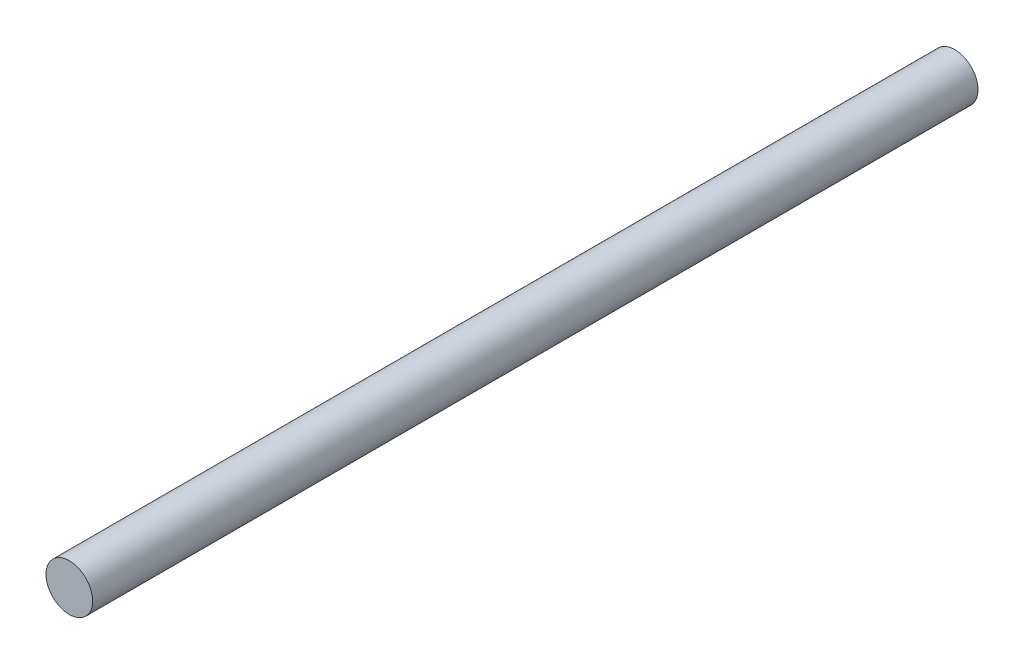
ISO-10303-21;
HEADER;
FILE_DESCRIPTION(('STEP AP214'),'2;1');
FILE_NAME('part.step','',(''),(''),'','','');
FILE_SCHEMA(('AUTOMOTIVE_DESIGN { 1 0 10303 214 1 1 1 1 }'));
ENDSEC;
DATA;
#1=APPLICATION_CONTEXT('core data for automotive mechanical design processes');
#2=APPLICATION_PROTOCOL_DEFINITION('international standard','automotive_design',2000,#1);
#3=PRODUCT_CONTEXT('',#1,'mechanical');
#4=PRODUCT('Part','Part','',(#3));
#5=PRODUCT_RELATED_PRODUCT_CATEGORY('part','',(#4));
#6=PRODUCT_DEFINITION_FORMATION('','',#4);
#7=PRODUCT_DEFINITION_CONTEXT('part definition',#1,'design');
#8=PRODUCT_DEFINITION('design','',#6,#7);
#9=PRODUCT_DEFINITION_SHAPE('','',#8);
#10=(LENGTH_UNIT() NAMED_UNIT(*) SI_UNIT(.MILLI.,.METRE.));
#11=(NAMED_UNIT(*) PLANE_ANGLE_UNIT() SI_UNIT($,.RADIAN.));
#12=(NAMED_UNIT(*) SI_UNIT($,.STERADIAN.) SOLID_ANGLE_UNIT());
#13=UNCERTAINTY_MEASURE_WITH_UNIT(LENGTH_MEASURE(1.E-05),#10,'distance_accuracy_value','');
#14=(GEOMETRIC_REPRESENTATION_CONTEXT(3) GLOBAL_UNCERTAINTY_ASSIGNED_CONTEXT((#13)) GLOBAL_UNIT_ASSIGNED_CONTEXT((#10,
#11,#12)) REPRESENTATION_CONTEXT('',''));
#15=CARTESIAN_POINT('',(0.,0.,0.));
#16=DIRECTION('',(0.,0.,1.));
#17=DIRECTION('',(1.,0.,0.));
#18=AXIS2_PLACEMENT_3D('',#15,#16,#17);
#19=CARTESIAN_POINT('',(0.,0.,304.8));
#20=DIRECTION('',(0.,0.,-1.));
#21=DIRECTION('',(-1.,0.,0.));
#22=AXIS2_PLACEMENT_3D('',#19,#20,#21);
#23=CYLINDRICAL_SURFACE('',#22,8.02656789146);
#24=CARTESIAN_POINT('',(0.,0.,304.8));
#25=DIRECTION('',(0.,0.,1.));
#26=DIRECTION('',(1.,0.,0.));
#27=AXIS2_PLACEMENT_3D('',#24,#25,#26);
#28=CIRCLE('',#27,8.02656789146);
#29=CARTESIAN_POINT('',(-8.02656789146,0.,304.8));
#30=VERTEX_POINT('',#29);
#31=EDGE_CURVE('E11',#30,#30,#28,.T.);
#32=CARTESIAN_POINT('',(0.,0.,0.));
#33=DIRECTION('',(0.,0.,1.));
#34=DIRECTION('',(1.,0.,0.));
#35=AXIS2_PLACEMENT_3D('',#32,#33,#34);
#36=CIRCLE('',#35,8.02656789146);
#37=CARTESIAN_POINT('',(-8.02656789146,0.,0.));
#38=VERTEX_POINT('',#37);
#39=EDGE_CURVE('E50',#38,#38,#36,.T.);
#40=CARTESIAN_POINT('',(-8.02656789146,0.,304.8));
#41=CARTESIAN_POINT('',(-8.02656789146,0.,301.625));
#42=CARTESIAN_POINT('',(-8.02656789146,0.,298.45));
#43=CARTESIAN_POINT('',(-8.02656789146,0.,292.1));
#44=CARTESIAN_POINT('',(-8.02656789146,0.,288.925));
#45=CARTESIAN_POINT('',(-8.02656789146,0.,282.575));
#46=CARTESIAN_POINT('',(-8.02656789146,0.,279.4));
#47=CARTESIAN_POINT('',(-8.02656789146,0.,273.05));
#48=CARTESIAN_POINT('',(-8.02656789146,0.,269.875));
#49=CARTESIAN_POINT('',(-8.02656789146,0.,263.525));
#50=CARTESIAN_POINT('',(-8.02656789146,0.,260.35));
#51=CARTESIAN_POINT('',(-8.02656789146,0.,254.));
#52=CARTESIAN_POINT('',(-8.02656789146,0.,250.825));
#53=CARTESIAN_POINT('',(-8.02656789146,0.,244.475));
#54=CARTESIAN_POINT('',(-8.02656789146,0.,241.3));
#55=CARTESIAN_POINT('',(-8.02656789146,0.,234.95));
#56=CARTESIAN_POINT('',(-8.02656789146,0.,231.775));
#57=CARTESIAN_POINT('',(-8.02656789146,0.,225.425));
#58=CARTESIAN_POINT('',(-8.02656789146,0.,222.25));
#59=CARTESIAN_POINT('',(-8.02656789146,0.,215.9));
#60=CARTESIAN_POINT('',(-8.02656789146,0.,212.725));
#61=CARTESIAN_POINT('',(-8.02656789146,0.,206.375));
#62=CARTESIAN_POINT('',(-8.02656789146,0.,203.2));
#63=CARTESIAN_POINT('',(-8.02656789146,0.,196.85));
#64=CARTESIAN_POINT('',(-8.02656789146,0.,193.675));
#65=CARTESIAN_POINT('',(-8.02656789146,0.,187.325));
#66=CARTESIAN_POINT('',(-8.02656789146,0.,184.15));
#67=CARTESIAN_POINT('',(-8.02656789146,0.,177.8));
#68=CARTESIAN_POINT('',(-8.02656789146,0.,174.625));
#69=CARTESIAN_POINT('',(-8.02656789146,0.,168.275));
#70=CARTESIAN_POINT('',(-8.02656789146,0.,165.1));
#71=CARTESIAN_POINT('',(-8.02656789146,0.,158.75));
#72=CARTESIAN_POINT('',(-8.02656789146,0.,155.575));
#73=CARTESIAN_POINT('',(-8.02656789146,0.,149.225));
#74=CARTESIAN_POINT('',(-8.02656789146,0.,146.05));
#75=CARTESIAN_POINT('',(-8.02656789146,0.,139.7));
#76=CARTESIAN_POINT('',(-8.02656789146,0.,136.525));
#77=CARTESIAN_POINT('',(-8.02656789146,0.,130.175));
#78=CARTESIAN_POINT('',(-8.02656789146,0.,127.));
#79=CARTESIAN_POINT('',(-8.02656789146,0.,120.65));
#80=CARTESIAN_POINT('',(-8.02656789146,0.,117.475));
#81=CARTESIAN_POINT('',(-8.02656789146,0.,111.125));
#82=CARTESIAN_POINT('',(-8.02656789146,0.,107.95));
#83=CARTESIAN_POINT('',(-8.02656789146,0.,101.6));
#84=CARTESIAN_POINT('',(-8.02656789146,0.,98.425));
#85=CARTESIAN_POINT('',(-8.02656789146,0.,92.075));
#86=CARTESIAN_POINT('',(-8.02656789146,0.,88.9));
#87=CARTESIAN_POINT('',(-8.02656789146,0.,82.55));
#88=CARTESIAN_POINT('',(-8.02656789146,0.,79.375));
#89=CARTESIAN_POINT('',(-8.02656789146,0.,73.025));
#90=CARTESIAN_POINT('',(-8.02656789146,0.,69.85));
#91=CARTESIAN_POINT('',(-8.02656789146,0.,63.5));
#92=CARTESIAN_POINT('',(-8.02656789146,0.,60.325));
#93=CARTESIAN_POINT('',(-8.02656789146,0.,53.975));
#94=CARTESIAN_POINT('',(-8.02656789146,0.,50.8));
#95=CARTESIAN_POINT('',(-8.02656789146,0.,44.45));
#96=CARTESIAN_POINT('',(-8.02656789146,0.,41.275));
#97=CARTESIAN_POINT('',(-8.02656789146,0.,34.925));
#98=CARTESIAN_POINT('',(-8.02656789146,0.,31.75));
#99=CARTESIAN_POINT('',(-8.02656789146,0.,25.4));
#100=CARTESIAN_POINT('',(-8.02656789146,0.,22.225));
#101=CARTESIAN_POINT('',(-8.02656789146,0.,15.875));
#102=CARTESIAN_POINT('',(-8.02656789146,0.,12.7));
#103=CARTESIAN_POINT('',(-8.02656789146,0.,6.35));
#104=CARTESIAN_POINT('',(-8.02656789146,0.,3.175));
#105=CARTESIAN_POINT('',(-8.02656789146,0.,0.));
#106=B_SPLINE_CURVE_WITH_KNOTS('',3,(#40,#41,#42,#43,#44,#45,#46,#47,#48,#49,#50,#51,#52,#53,
#54,#55,#56,#57,#58,#59,#60,#61,#62,#63,#64,#65,#66,#67,#68,#69,#70,#71,#72,#73,#74,#75,#76,#77,
#78,#79,#80,#81,#82,#83,#84,#85,#86,#87,#88,#89,#90,#91,#92,#93,#94,#95,#96,#97,#98,#99,#100,
#101,#102,#103,#104,#105),.UNSPECIFIED.,.F.,.F.,(4,2,2,2,2,2,2,2,2,2,2,2,2,2,2,2,2,2,2,2,2,2,2,
2,2,2,2,2,2,2,2,2,4),(0.,9.52500000000001,19.05,28.575,38.1,47.625,57.15,66.675,76.2,
85.7250000000001,95.2500000000001,104.775,114.3,123.825,133.35,142.875,152.4,161.925,171.45,
180.975,190.5,200.025,209.55,219.075,228.6,238.125,247.65,257.175,266.7,276.225,285.75,295.275,
304.8),.UNSPECIFIED.);
#107=EDGE_CURVE('BSEAM47',#30,#38,#106,.T.);
#108=ORIENTED_EDGE('',*,*,#31,.F.);
#109=ORIENTED_EDGE('',*,*,#39,.T.);
#110=ORIENTED_EDGE('',*,*,#107,.T.);
#111=ORIENTED_EDGE('',*,*,#107,.F.);
#112=EDGE_LOOP('',(#108,#110,#109,#111));
#113=FACE_BOUND('',#112,.T.);
#114=ADVANCED_FACE('F47',(#113),#23,.T.);
#115=CARTESIAN_POINT('',(0.,0.,304.8));
#116=DIRECTION('',(0.,0.,1.));
#117=DIRECTION('',(1.,0.,0.));
#118=AXIS2_PLACEMENT_3D('',#115,#116,#117);
#119=PLANE('',#118);
#120=ORIENTED_EDGE('',*,*,#31,.T.);
#121=EDGE_LOOP('',(#120));
#122=FACE_BOUND('',#121,.T.);
#123=ADVANCED_FACE('F66',(#122),#119,.T.);
#124=CARTESIAN_POINT('',(0.,0.,0.));
#125=DIRECTION('',(0.,0.,1.));
#126=DIRECTION('',(1.,0.,0.));
#127=AXIS2_PLACEMENT_3D('',#124,#125,#126);
#128=PLANE('',#127);
#129=ORIENTED_EDGE('',*,*,#39,.F.);
#130=EDGE_LOOP('',(#129));
#131=FACE_BOUND('',#130,.T.);
#132=ADVANCED_FACE('F64',(#131),#128,.F.);
#133=CLOSED_SHELL('',(#114,#123,#132));
#134=MANIFOLD_SOLID_BREP('B2',#133);
#135=ADVANCED_BREP_SHAPE_REPRESENTATION('',(#18,#134),#14);
#136=SHAPE_DEFINITION_REPRESENTATION(#9,#135);
ENDSEC;
END-ISO-10303-21;
